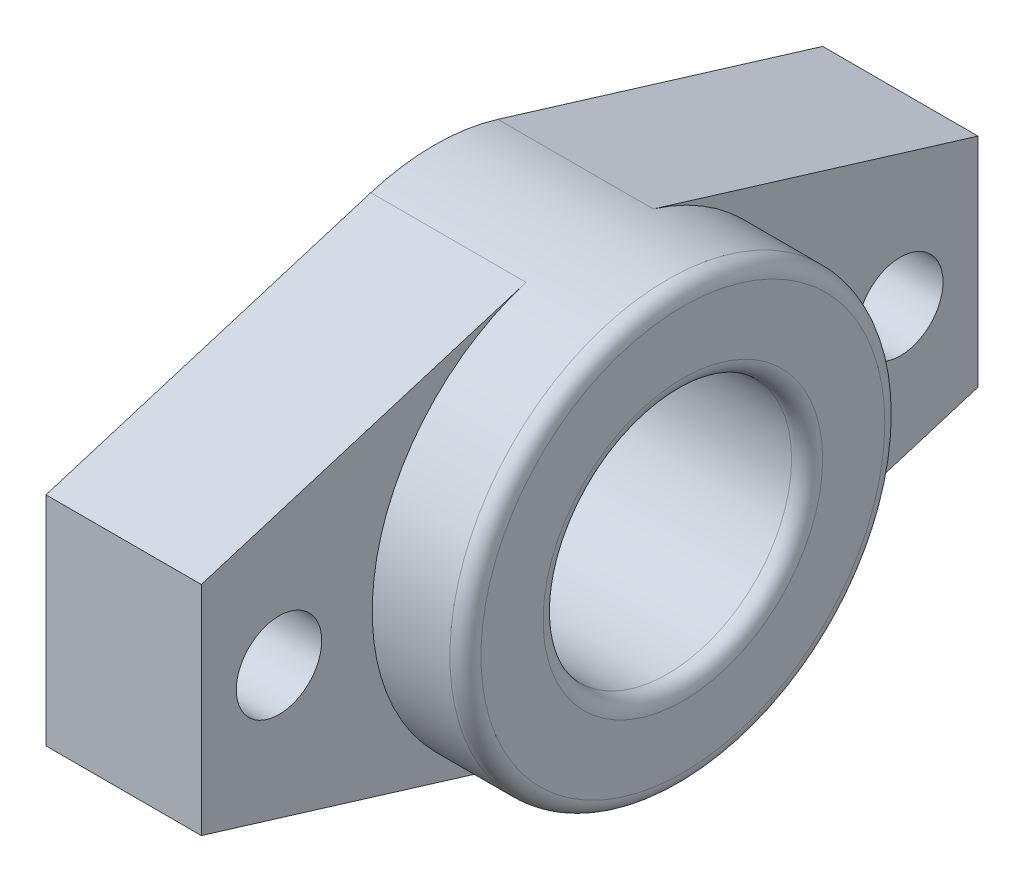
ISO-10303-21;
HEADER;
FILE_DESCRIPTION(('STEP AP214'),'2;1');
FILE_NAME('part.step','',(''),(''),'','','');
FILE_SCHEMA(('AUTOMOTIVE_DESIGN { 1 0 10303 214 1 1 1 1 }'));
ENDSEC;
DATA;
#1=APPLICATION_CONTEXT('core data for automotive mechanical design processes');
#2=APPLICATION_PROTOCOL_DEFINITION('international standard','automotive_design',2000,#1);
#3=PRODUCT_CONTEXT('',#1,'mechanical');
#4=PRODUCT('Part','Part','',(#3));
#5=PRODUCT_RELATED_PRODUCT_CATEGORY('part','',(#4));
#6=PRODUCT_DEFINITION_FORMATION('','',#4);
#7=PRODUCT_DEFINITION_CONTEXT('part definition',#1,'design');
#8=PRODUCT_DEFINITION('design','',#6,#7);
#9=PRODUCT_DEFINITION_SHAPE('','',#8);
#10=(LENGTH_UNIT() NAMED_UNIT(*) SI_UNIT(.MILLI.,.METRE.));
#11=(NAMED_UNIT(*) PLANE_ANGLE_UNIT() SI_UNIT($,.RADIAN.));
#12=(NAMED_UNIT(*) SI_UNIT($,.STERADIAN.) SOLID_ANGLE_UNIT());
#13=UNCERTAINTY_MEASURE_WITH_UNIT(LENGTH_MEASURE(1.E-05),#10,'distance_accuracy_value','');
#14=(GEOMETRIC_REPRESENTATION_CONTEXT(3) GLOBAL_UNCERTAINTY_ASSIGNED_CONTEXT((#13)) GLOBAL_UNIT_ASSIGNED_CONTEXT((#10,
#11,#12)) REPRESENTATION_CONTEXT('',''));
#15=CARTESIAN_POINT('',(0.,0.,0.));
#16=DIRECTION('',(0.,0.,1.));
#17=DIRECTION('',(1.,0.,0.));
#18=AXIS2_PLACEMENT_3D('',#15,#16,#17);
#19=CARTESIAN_POINT('',(10.,14.,-25.));
#20=DIRECTION('',(1.,0.,0.));
#21=DIRECTION('',(0.,0.,-1.));
#22=AXIS2_PLACEMENT_3D('',#19,#20,#21);
#23=PLANE('',#22);
#24=CARTESIAN_POINT('',(10.,14.,-5.));
#25=DIRECTION('',(1.,0.,0.));
#26=DIRECTION('',(0.,0.,-1.));
#27=AXIS2_PLACEMENT_3D('',#24,#25,#26);
#28=CIRCLE('',#27,2.75);
#29=CARTESIAN_POINT('',(10.,14.,-7.75));
#30=VERTEX_POINT('',#29);
#31=EDGE_CURVE('E234',#30,#30,#28,.T.);
#32=ORIENTED_EDGE('',*,*,#31,.F.);
#33=EDGE_LOOP('',(#32));
#34=FACE_BOUND('',#33,.T.);
#35=CARTESIAN_POINT('',(10.,14.,-25.));
#36=DIRECTION('',(1.,0.,0.));
#37=DIRECTION('',(0.,0.,-1.));
#38=AXIS2_PLACEMENT_3D('',#35,#36,#37);
#39=CIRCLE('',#38,14.);
#40=CARTESIAN_POINT('',(10.,27.3889078459591,-20.9088941968685));
#41=VERTEX_POINT('',#40);
#42=CARTESIAN_POINT('',(10.,0.61109215404094,-20.9088941968685));
#43=VERTEX_POINT('',#42);
#44=EDGE_CURVE('E60',#41,#43,#39,.T.);
#45=ORIENTED_EDGE('',*,*,#44,.F.);
#46=DIRECTION('',(0.,-0.292221843080819,0.956350560425647));
#47=VECTOR('',#46,1.);
#48=CARTESIAN_POINT('',(10.,21.,0.));
#49=LINE('',#48,#47);
#50=CARTESIAN_POINT('',(10.,21.,0.));
#51=VERTEX_POINT('',#50);
#52=EDGE_CURVE('E164',#41,#51,#49,.T.);
#53=ORIENTED_EDGE('',*,*,#52,.T.);
#54=DIRECTION('',(0.,-1.,0.));
#55=VECTOR('',#54,1.);
#56=CARTESIAN_POINT('',(10.,7.,0.));
#57=LINE('',#56,#55);
#58=CARTESIAN_POINT('',(10.,7.,0.));
#59=VERTEX_POINT('',#58);
#60=EDGE_CURVE('E106',#51,#59,#57,.T.);
#61=ORIENTED_EDGE('',*,*,#60,.T.);
#62=DIRECTION('',(0.,-0.292221843080819,-0.956350560425647));
#63=VECTOR('',#62,1.);
#64=CARTESIAN_POINT('',(10.,7.,0.));
#65=LINE('',#64,#63);
#66=EDGE_CURVE('E129',#59,#43,#65,.T.);
#67=ORIENTED_EDGE('',*,*,#66,.T.);
#68=EDGE_LOOP('',(#45,#53,#61,#67));
#69=FACE_BOUND('',#68,.T.);
#70=ADVANCED_FACE('F43',(#34,#69),#23,.T.);
#71=CARTESIAN_POINT('',(10.,21.,0.));
#72=DIRECTION('',(0.,-0.956350560425647,-0.292221843080819));
#73=DIRECTION('',(0.,0.292221843080819,-0.956350560425647));
#74=AXIS2_PLACEMENT_3D('',#71,#72,#73);
#75=PLANE('',#74);
#76=DIRECTION('',(0.,-0.292221843080819,0.956350560425647));
#77=VECTOR('',#76,1.);
#78=CARTESIAN_POINT('',(0.,21.,0.));
#79=LINE('',#78,#77);
#80=CARTESIAN_POINT('',(0.,27.3889078459591,-20.9088941968685));
#81=VERTEX_POINT('',#80);
#82=CARTESIAN_POINT('',(0.,21.,0.));
#83=VERTEX_POINT('',#82);
#84=EDGE_CURVE('E149',#81,#83,#79,.T.);
#85=ORIENTED_EDGE('',*,*,#84,.T.);
#86=DIRECTION('',(-1.,0.,0.));
#87=VECTOR('',#86,1.);
#88=CARTESIAN_POINT('',(10.,21.,0.));
#89=LINE('',#88,#87);
#90=EDGE_CURVE('E176',#51,#83,#89,.T.);
#91=ORIENTED_EDGE('',*,*,#90,.F.);
#92=ORIENTED_EDGE('',*,*,#52,.F.);
#93=DIRECTION('',(-1.,0.,0.));
#94=VECTOR('',#93,1.);
#95=CARTESIAN_POINT('',(10.,27.3889078459591,-20.9088941968685));
#96=LINE('',#95,#94);
#97=EDGE_CURVE('E145',#41,#81,#96,.T.);
#98=ORIENTED_EDGE('',*,*,#97,.T.);
#99=EDGE_LOOP('',(#85,#91,#92,#98));
#100=FACE_BOUND('',#99,.T.);
#101=ADVANCED_FACE('F208',(#100),#75,.F.);
#102=CARTESIAN_POINT('',(10.,7.,0.));
#103=DIRECTION('',(0.,0.,-1.));
#104=DIRECTION('',(-1.,0.,0.));
#105=AXIS2_PLACEMENT_3D('',#102,#103,#104);
#106=PLANE('',#105);
#107=DIRECTION('',(0.,-1.,0.));
#108=VECTOR('',#107,1.);
#109=CARTESIAN_POINT('',(0.,7.,0.));
#110=LINE('',#109,#108);
#111=CARTESIAN_POINT('',(0.,7.,0.));
#112=VERTEX_POINT('',#111);
#113=EDGE_CURVE('E152',#83,#112,#110,.T.);
#114=ORIENTED_EDGE('',*,*,#113,.T.);
#115=DIRECTION('',(-1.,0.,0.));
#116=VECTOR('',#115,1.);
#117=CARTESIAN_POINT('',(10.,7.,0.));
#118=LINE('',#117,#116);
#119=EDGE_CURVE('E173',#59,#112,#118,.T.);
#120=ORIENTED_EDGE('',*,*,#119,.F.);
#121=ORIENTED_EDGE('',*,*,#60,.F.);
#122=ORIENTED_EDGE('',*,*,#90,.T.);
#123=EDGE_LOOP('',(#114,#120,#121,#122));
#124=FACE_BOUND('',#123,.T.);
#125=ADVANCED_FACE('F216',(#124),#106,.F.);
#126=CARTESIAN_POINT('',(10.,7.,0.));
#127=DIRECTION('',(0.,0.956350560425647,-0.292221843080819));
#128=DIRECTION('',(0.,0.292221843080819,0.956350560425647));
#129=AXIS2_PLACEMENT_3D('',#126,#127,#128);
#130=PLANE('',#129);
#131=DIRECTION('',(0.,-0.292221843080819,-0.956350560425647));
#132=VECTOR('',#131,1.);
#133=CARTESIAN_POINT('',(0.,7.,0.));
#134=LINE('',#133,#132);
#135=CARTESIAN_POINT('',(0.,0.61109215404094,-20.9088941968685));
#136=VERTEX_POINT('',#135);
#137=EDGE_CURVE('E155',#112,#136,#134,.T.);
#138=ORIENTED_EDGE('',*,*,#137,.T.);
#139=DIRECTION('',(-1.,0.,0.));
#140=VECTOR('',#139,1.);
#141=CARTESIAN_POINT('',(10.,0.61109215404094,-20.9088941968685));
#142=LINE('',#141,#140);
#143=EDGE_CURVE('E170',#43,#136,#142,.T.);
#144=ORIENTED_EDGE('',*,*,#143,.F.);
#145=ORIENTED_EDGE('',*,*,#66,.F.);
#146=ORIENTED_EDGE('',*,*,#119,.T.);
#147=EDGE_LOOP('',(#138,#144,#145,#146));
#148=FACE_BOUND('',#147,.T.);
#149=ADVANCED_FACE('F246',(#148),#130,.F.);
#150=CARTESIAN_POINT('',(10.,7.,-50.));
#151=DIRECTION('',(0.,0.956350560425647,0.292221843080819));
#152=DIRECTION('',(0.,-0.292221843080819,0.956350560425647));
#153=AXIS2_PLACEMENT_3D('',#150,#151,#152);
#154=PLANE('',#153);
#155=DIRECTION('',(0.,0.292221843080819,-0.956350560425647));
#156=VECTOR('',#155,1.);
#157=CARTESIAN_POINT('',(0.,7.,-50.));
#158=LINE('',#157,#156);
#159=CARTESIAN_POINT('',(0.,0.611092154040942,-29.0911058031315));
#160=VERTEX_POINT('',#159);
#161=CARTESIAN_POINT('',(0.,7.,-50.));
#162=VERTEX_POINT('',#161);
#163=EDGE_CURVE('E135',#160,#162,#158,.T.);
#164=ORIENTED_EDGE('',*,*,#163,.T.);
#165=DIRECTION('',(-1.,0.,0.));
#166=VECTOR('',#165,1.);
#167=CARTESIAN_POINT('',(10.,7.,-50.));
#168=LINE('',#167,#166);
#169=CARTESIAN_POINT('',(10.,7.,-50.));
#170=VERTEX_POINT('',#169);
#171=EDGE_CURVE('E132',#170,#162,#168,.T.);
#172=ORIENTED_EDGE('',*,*,#171,.F.);
#173=DIRECTION('',(0.,0.292221843080819,-0.956350560425647));
#174=VECTOR('',#173,1.);
#175=CARTESIAN_POINT('',(10.,7.,-50.));
#176=LINE('',#175,#174);
#177=CARTESIAN_POINT('',(10.,0.611092154040942,-29.0911058031315));
#178=VERTEX_POINT('',#177);
#179=EDGE_CURVE('E117',#178,#170,#176,.T.);
#180=ORIENTED_EDGE('',*,*,#179,.F.);
#181=DIRECTION('',(-1.,0.,0.));
#182=VECTOR('',#181,1.);
#183=CARTESIAN_POINT('',(10.,0.611092154040942,-29.0911058031315));
#184=LINE('',#183,#182);
#185=EDGE_CURVE('E138',#178,#160,#184,.T.);
#186=ORIENTED_EDGE('',*,*,#185,.T.);
#187=EDGE_LOOP('',(#164,#172,#180,#186));
#188=FACE_BOUND('',#187,.T.);
#189=ADVANCED_FACE('F133',(#188),#154,.F.);
#190=CARTESIAN_POINT('',(10.,7.,-50.));
#191=DIRECTION('',(0.,0.,1.));
#192=DIRECTION('',(1.,0.,0.));
#193=AXIS2_PLACEMENT_3D('',#190,#191,#192);
#194=PLANE('',#193);
#195=DIRECTION('',(0.,1.,0.));
#196=VECTOR('',#195,1.);
#197=CARTESIAN_POINT('',(0.,7.,-50.));
#198=LINE('',#197,#196);
#199=CARTESIAN_POINT('',(0.,21.,-50.));
#200=VERTEX_POINT('',#199);
#201=EDGE_CURVE('E160',#162,#200,#198,.T.);
#202=ORIENTED_EDGE('',*,*,#201,.T.);
#203=DIRECTION('',(-1.,0.,0.));
#204=VECTOR('',#203,1.);
#205=CARTESIAN_POINT('',(10.,21.,-50.));
#206=LINE('',#205,#204);
#207=CARTESIAN_POINT('',(10.,21.,-50.));
#208=VERTEX_POINT('',#207);
#209=EDGE_CURVE('E139',#208,#200,#206,.T.);
#210=ORIENTED_EDGE('',*,*,#209,.F.);
#211=DIRECTION('',(0.,1.,0.));
#212=VECTOR('',#211,1.);
#213=CARTESIAN_POINT('',(10.,7.,-50.));
#214=LINE('',#213,#212);
#215=EDGE_CURVE('E122',#170,#208,#214,.T.);
#216=ORIENTED_EDGE('',*,*,#215,.F.);
#217=ORIENTED_EDGE('',*,*,#171,.T.);
#218=EDGE_LOOP('',(#202,#210,#216,#217));
#219=FACE_BOUND('',#218,.T.);
#220=ADVANCED_FACE('F141',(#219),#194,.F.);
#221=CARTESIAN_POINT('',(10.,21.,-50.));
#222=DIRECTION('',(0.,-0.956350560425647,0.292221843080819));
#223=DIRECTION('',(0.,-0.292221843080819,-0.956350560425647));
#224=AXIS2_PLACEMENT_3D('',#221,#222,#223);
#225=PLANE('',#224);
#226=DIRECTION('',(0.,0.292221843080819,0.956350560425647));
#227=VECTOR('',#226,1.);
#228=CARTESIAN_POINT('',(0.,21.,-50.));
#229=LINE('',#228,#227);
#230=CARTESIAN_POINT('',(0.,27.3889078459591,-29.0911058031315));
#231=VERTEX_POINT('',#230);
#232=EDGE_CURVE('E91',#200,#231,#229,.T.);
#233=ORIENTED_EDGE('',*,*,#232,.T.);
#234=DIRECTION('',(-1.,0.,0.));
#235=VECTOR('',#234,1.);
#236=CARTESIAN_POINT('',(10.,27.3889078459591,-29.0911058031315));
#237=LINE('',#236,#235);
#238=CARTESIAN_POINT('',(10.,27.3889078459591,-29.0911058031315));
#239=VERTEX_POINT('',#238);
#240=EDGE_CURVE('E166',#239,#231,#237,.T.);
#241=ORIENTED_EDGE('',*,*,#240,.F.);
#242=DIRECTION('',(0.,0.292221843080819,0.956350560425647));
#243=VECTOR('',#242,1.);
#244=CARTESIAN_POINT('',(10.,21.,-50.));
#245=LINE('',#244,#243);
#246=EDGE_CURVE('E143',#208,#239,#245,.T.);
#247=ORIENTED_EDGE('',*,*,#246,.F.);
#248=ORIENTED_EDGE('',*,*,#209,.T.);
#249=EDGE_LOOP('',(#233,#241,#247,#248));
#250=FACE_BOUND('',#249,.T.);
#251=ADVANCED_FACE('F228',(#250),#225,.F.);
#252=CARTESIAN_POINT('',(10.,14.,-25.));
#253=DIRECTION('',(-1.,0.,0.));
#254=DIRECTION('',(0.,0.,1.));
#255=AXIS2_PLACEMENT_3D('',#252,#253,#254);
#256=CYLINDRICAL_SURFACE('',#255,14.);
#257=CARTESIAN_POINT('',(15.,14.,-25.));
#258=DIRECTION('',(1.,0.,0.));
#259=DIRECTION('',(0.,0.,-1.));
#260=AXIS2_PLACEMENT_3D('',#257,#258,#259);
#261=CIRCLE('',#260,14.);
#262=CARTESIAN_POINT('',(15.,14.,-39.));
#263=VERTEX_POINT('',#262);
#264=EDGE_CURVE('E11',#263,#263,#261,.F.);
#265=ORIENTED_EDGE('',*,*,#264,.T.);
#266=EDGE_LOOP('',(#265));
#267=FACE_BOUND('',#266,.T.);
#268=CARTESIAN_POINT('',(0.,14.,-25.));
#269=DIRECTION('',(1.,0.,0.));
#270=DIRECTION('',(0.,0.,-1.));
#271=AXIS2_PLACEMENT_3D('',#268,#269,#270);
#272=CIRCLE('',#271,14.);
#273=EDGE_CURVE('E97',#231,#81,#272,.T.);
#274=ORIENTED_EDGE('',*,*,#273,.T.);
#275=ORIENTED_EDGE('',*,*,#97,.F.);
#276=ORIENTED_EDGE('',*,*,#44,.T.);
#277=ORIENTED_EDGE('',*,*,#143,.T.);
#278=CARTESIAN_POINT('',(0.,14.,-25.));
#279=DIRECTION('',(1.,0.,0.));
#280=DIRECTION('',(0.,0.,1.));
#281=AXIS2_PLACEMENT_3D('',#278,#279,#280);
#282=CIRCLE('',#281,14.);
#283=EDGE_CURVE('E157',#136,#160,#282,.T.);
#284=ORIENTED_EDGE('',*,*,#283,.T.);
#285=ORIENTED_EDGE('',*,*,#185,.F.);
#286=EDGE_CURVE('E125',#178,#239,#39,.T.);
#287=ORIENTED_EDGE('',*,*,#286,.T.);
#288=ORIENTED_EDGE('',*,*,#240,.T.);
#289=EDGE_LOOP('',(#274,#275,#276,#277,#284,#285,#287,#288));
#290=FACE_BOUND('',#289,.T.);
#291=ADVANCED_FACE('F221',(#267,#290),#256,.T.);
#292=CARTESIAN_POINT('',(10.,14.,-45.));
#293=DIRECTION('',(1.,0.,0.));
#294=DIRECTION('',(0.,0.,-1.));
#295=AXIS2_PLACEMENT_3D('',#292,#293,#294);
#296=CIRCLE('',#295,2.75);
#297=CARTESIAN_POINT('',(10.,14.,-47.75));
#298=VERTEX_POINT('',#297);
#299=EDGE_CURVE('E153',#298,#298,#296,.T.);
#300=ORIENTED_EDGE('',*,*,#299,.F.);
#301=EDGE_LOOP('',(#300));
#302=FACE_BOUND('',#301,.T.);
#303=ORIENTED_EDGE('',*,*,#286,.F.);
#304=ORIENTED_EDGE('',*,*,#179,.T.);
#305=ORIENTED_EDGE('',*,*,#215,.T.);
#306=ORIENTED_EDGE('',*,*,#246,.T.);
#307=EDGE_LOOP('',(#303,#304,#305,#306));
#308=FACE_BOUND('',#307,.T.);
#309=ADVANCED_FACE('F119',(#302,#308),#23,.T.);
#310=CARTESIAN_POINT('',(0.,14.,-25.));
#311=DIRECTION('',(1.,0.,0.));
#312=DIRECTION('',(0.,0.,-1.));
#313=AXIS2_PLACEMENT_3D('',#310,#311,#312);
#314=PLANE('',#313);
#315=CARTESIAN_POINT('',(0.,14.,-45.));
#316=DIRECTION('',(-1.,0.,0.));
#317=DIRECTION('',(0.,0.,1.));
#318=AXIS2_PLACEMENT_3D('',#315,#316,#317);
#319=CIRCLE('',#318,2.75);
#320=CARTESIAN_POINT('',(0.,14.,-42.25));
#321=VERTEX_POINT('',#320);
#322=EDGE_CURVE('E237',#321,#321,#319,.T.);
#323=ORIENTED_EDGE('',*,*,#322,.F.);
#324=EDGE_LOOP('',(#323));
#325=FACE_BOUND('',#324,.T.);
#326=CARTESIAN_POINT('',(0.,14.,-25.));
#327=DIRECTION('',(-1.,0.,0.));
#328=DIRECTION('',(0.,0.,1.));
#329=AXIS2_PLACEMENT_3D('',#326,#327,#328);
#330=CIRCLE('',#329,8.);
#331=CARTESIAN_POINT('',(0.,14.,-17.));
#332=VERTEX_POINT('',#331);
#333=EDGE_CURVE('E356',#332,#332,#330,.T.);
#334=ORIENTED_EDGE('',*,*,#333,.F.);
#335=EDGE_LOOP('',(#334));
#336=FACE_BOUND('',#335,.T.);
#337=CARTESIAN_POINT('',(0.,14.,-5.));
#338=DIRECTION('',(-1.,0.,0.));
#339=DIRECTION('',(0.,0.,1.));
#340=AXIS2_PLACEMENT_3D('',#337,#338,#339);
#341=CIRCLE('',#340,2.75);
#342=CARTESIAN_POINT('',(0.,14.,-2.25));
#343=VERTEX_POINT('',#342);
#344=EDGE_CURVE('E359',#343,#343,#341,.T.);
#345=ORIENTED_EDGE('',*,*,#344,.F.);
#346=EDGE_LOOP('',(#345));
#347=FACE_BOUND('',#346,.T.);
#348=ORIENTED_EDGE('',*,*,#84,.F.);
#349=ORIENTED_EDGE('',*,*,#273,.F.);
#350=ORIENTED_EDGE('',*,*,#232,.F.);
#351=ORIENTED_EDGE('',*,*,#201,.F.);
#352=ORIENTED_EDGE('',*,*,#163,.F.);
#353=ORIENTED_EDGE('',*,*,#283,.F.);
#354=ORIENTED_EDGE('',*,*,#137,.F.);
#355=ORIENTED_EDGE('',*,*,#113,.F.);
#356=EDGE_LOOP('',(#348,#349,#350,#351,#352,#353,#354,#355));
#357=FACE_BOUND('',#356,.T.);
#358=ADVANCED_FACE('F198',(#325,#336,#347,#357),#314,.F.);
#359=CARTESIAN_POINT('',(16.,14.,-25.));
#360=DIRECTION('',(1.,0.,0.));
#361=DIRECTION('',(0.,0.,-1.));
#362=AXIS2_PLACEMENT_3D('',#359,#360,#361);
#363=PLANE('',#362);
#364=CARTESIAN_POINT('',(16.,14.,-25.));
#365=DIRECTION('',(1.,0.,0.));
#366=DIRECTION('',(0.,0.,-1.));
#367=AXIS2_PLACEMENT_3D('',#364,#365,#366);
#368=CIRCLE('',#367,9.);
#369=CARTESIAN_POINT('',(16.,14.,-34.));
#370=VERTEX_POINT('',#369);
#371=EDGE_CURVE('E181',#370,#370,#368,.F.);
#372=ORIENTED_EDGE('',*,*,#371,.T.);
#373=EDGE_LOOP('',(#372));
#374=FACE_BOUND('',#373,.T.);
#375=CARTESIAN_POINT('',(16.,14.,-25.));
#376=DIRECTION('',(1.,0.,0.));
#377=DIRECTION('',(0.,0.,-1.));
#378=AXIS2_PLACEMENT_3D('',#375,#376,#377);
#379=CIRCLE('',#378,13.);
#380=CARTESIAN_POINT('',(16.,14.,-38.));
#381=VERTEX_POINT('',#380);
#382=EDGE_CURVE('E178',#381,#381,#379,.T.);
#383=ORIENTED_EDGE('',*,*,#382,.T.);
#384=EDGE_LOOP('',(#383));
#385=FACE_BOUND('',#384,.T.);
#386=ADVANCED_FACE('F195',(#374,#385),#363,.T.);
#387=CARTESIAN_POINT('',(16.,14.,-25.));
#388=DIRECTION('',(-1.,0.,0.));
#389=DIRECTION('',(0.,0.,1.));
#390=AXIS2_PLACEMENT_3D('',#387,#388,#389);
#391=CYLINDRICAL_SURFACE('',#390,8.);
#392=CARTESIAN_POINT('',(15.,14.,-25.));
#393=DIRECTION('',(1.,0.,0.));
#394=DIRECTION('',(0.,0.,-1.));
#395=AXIS2_PLACEMENT_3D('',#392,#393,#394);
#396=CIRCLE('',#395,8.);
#397=CARTESIAN_POINT('',(15.,14.,-33.));
#398=VERTEX_POINT('',#397);
#399=EDGE_CURVE('E52',#398,#398,#396,.T.);
#400=ORIENTED_EDGE('',*,*,#399,.T.);
#401=EDGE_LOOP('',(#400));
#402=FACE_BOUND('',#401,.T.);
#403=ORIENTED_EDGE('',*,*,#333,.T.);
#404=EDGE_LOOP('',(#403));
#405=FACE_BOUND('',#404,.T.);
#406=ADVANCED_FACE('F186',(#402,#405),#391,.F.);
#407=CARTESIAN_POINT('',(16.,14.,-5.));
#408=DIRECTION('',(-1.,0.,0.));
#409=DIRECTION('',(0.,0.,1.));
#410=AXIS2_PLACEMENT_3D('',#407,#408,#409);
#411=CYLINDRICAL_SURFACE('',#410,2.75);
#412=ORIENTED_EDGE('',*,*,#31,.T.);
#413=EDGE_LOOP('',(#412));
#414=FACE_BOUND('',#413,.T.);
#415=ORIENTED_EDGE('',*,*,#344,.T.);
#416=EDGE_LOOP('',(#415));
#417=FACE_BOUND('',#416,.T.);
#418=ADVANCED_FACE('F319',(#414,#417),#411,.F.);
#419=CARTESIAN_POINT('',(16.,14.,-45.));
#420=DIRECTION('',(-1.,0.,0.));
#421=DIRECTION('',(0.,0.,1.));
#422=AXIS2_PLACEMENT_3D('',#419,#420,#421);
#423=CYLINDRICAL_SURFACE('',#422,2.75);
#424=ORIENTED_EDGE('',*,*,#299,.T.);
#425=EDGE_LOOP('',(#424));
#426=FACE_BOUND('',#425,.T.);
#427=ORIENTED_EDGE('',*,*,#322,.T.);
#428=EDGE_LOOP('',(#427));
#429=FACE_BOUND('',#428,.T.);
#430=ADVANCED_FACE('F192',(#426,#429),#423,.F.);
#431=CARTESIAN_POINT('',(15.,14.,-25.));
#432=DIRECTION('',(1.,0.,0.));
#433=DIRECTION('',(0.,0.,-1.));
#434=AXIS2_PLACEMENT_3D('',#431,#432,#433);
#435=TOROIDAL_SURFACE('',#434,9.,1.);
#436=ORIENTED_EDGE('',*,*,#399,.F.);
#437=EDGE_LOOP('',(#436));
#438=FACE_BOUND('',#437,.T.);
#439=ORIENTED_EDGE('',*,*,#371,.F.);
#440=EDGE_LOOP('',(#439));
#441=FACE_BOUND('',#440,.T.);
#442=ADVANCED_FACE('F189',(#438,#441),#435,.T.);
#443=CARTESIAN_POINT('',(15.,14.,-25.));
#444=DIRECTION('',(1.,0.,0.));
#445=DIRECTION('',(0.,0.,-1.));
#446=AXIS2_PLACEMENT_3D('',#443,#444,#445);
#447=TOROIDAL_SURFACE('',#446,13.,1.);
#448=ORIENTED_EDGE('',*,*,#264,.F.);
#449=EDGE_LOOP('',(#448));
#450=FACE_BOUND('',#449,.T.);
#451=ORIENTED_EDGE('',*,*,#382,.F.);
#452=EDGE_LOOP('',(#451));
#453=FACE_BOUND('',#452,.T.);
#454=ADVANCED_FACE('F45',(#450,#453),#447,.T.);
#455=CLOSED_SHELL('',(#70,#101,#125,#149,#189,#220,#251,#291,#309,#358,#386,#406,#418,#430,#442,#454));
#456=MANIFOLD_SOLID_BREP('B2',#455);
#457=ADVANCED_BREP_SHAPE_REPRESENTATION('',(#18,#456),#14);
#458=SHAPE_DEFINITION_REPRESENTATION(#9,#457);
ENDSEC;
END-ISO-10303-21;
